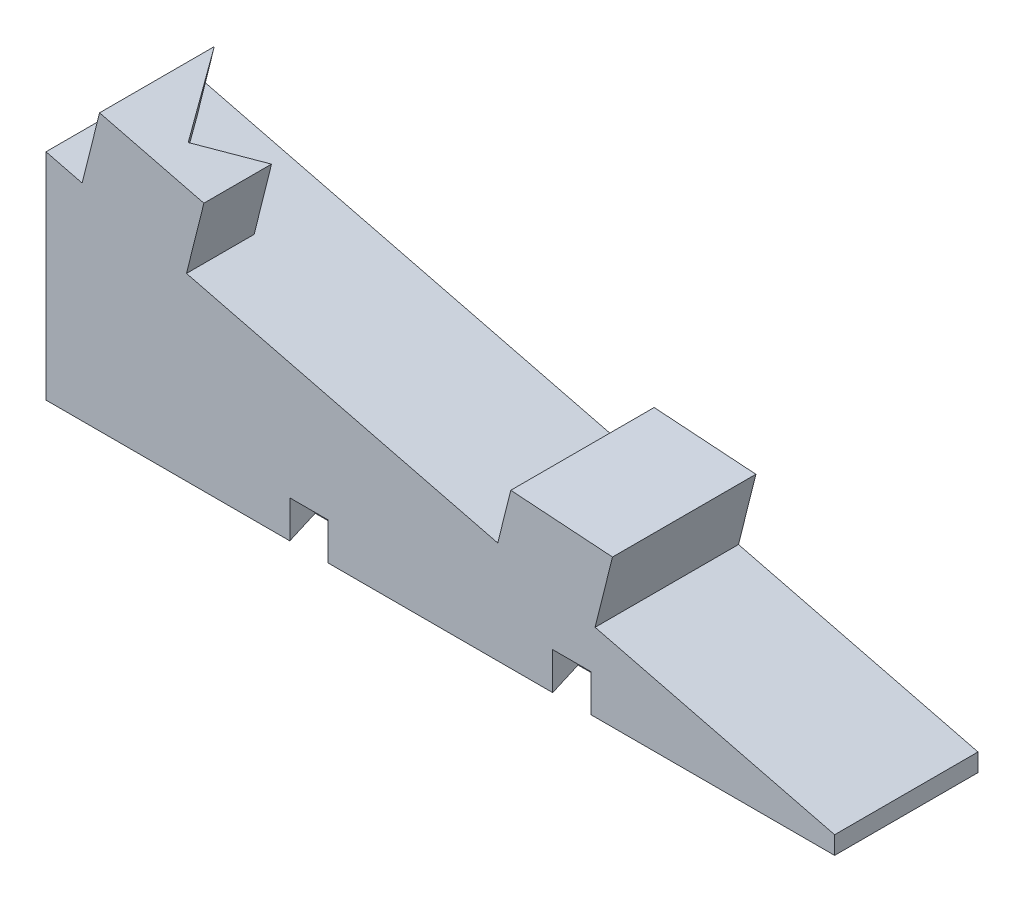
ISO-10303-21;
HEADER;
FILE_DESCRIPTION(('STEP AP214'),'2;1');
FILE_NAME('part.step','',(''),(''),'','','');
FILE_SCHEMA(('AUTOMOTIVE_DESIGN { 1 0 10303 214 1 1 1 1 }'));
ENDSEC;
DATA;
#1=APPLICATION_CONTEXT('core data for automotive mechanical design processes');
#2=APPLICATION_PROTOCOL_DEFINITION('international standard','automotive_design',2000,#1);
#3=PRODUCT_CONTEXT('',#1,'mechanical');
#4=PRODUCT('Part','Part','',(#3));
#5=PRODUCT_RELATED_PRODUCT_CATEGORY('part','',(#4));
#6=PRODUCT_DEFINITION_FORMATION('','',#4);
#7=PRODUCT_DEFINITION_CONTEXT('part definition',#1,'design');
#8=PRODUCT_DEFINITION('design','',#6,#7);
#9=PRODUCT_DEFINITION_SHAPE('','',#8);
#10=(LENGTH_UNIT() NAMED_UNIT(*) SI_UNIT(.MILLI.,.METRE.));
#11=(NAMED_UNIT(*) PLANE_ANGLE_UNIT() SI_UNIT($,.RADIAN.));
#12=(NAMED_UNIT(*) SI_UNIT($,.STERADIAN.) SOLID_ANGLE_UNIT());
#13=UNCERTAINTY_MEASURE_WITH_UNIT(LENGTH_MEASURE(1.E-05),#10,'distance_accuracy_value','');
#14=(GEOMETRIC_REPRESENTATION_CONTEXT(3) GLOBAL_UNCERTAINTY_ASSIGNED_CONTEXT((#13)) GLOBAL_UNIT_ASSIGNED_CONTEXT((#10,
#11,#12)) REPRESENTATION_CONTEXT('',''));
#15=CARTESIAN_POINT('',(0.,0.,0.));
#16=DIRECTION('',(0.,0.,1.));
#17=DIRECTION('',(1.,0.,0.));
#18=AXIS2_PLACEMENT_3D('',#15,#16,#17);
#19=CARTESIAN_POINT('',(-55.,21.875,-10.));
#20=DIRECTION('',(0.242535625036333,0.970142500145332,0.));
#21=DIRECTION('',(-0.970142500145332,0.242535625036333,0.));
#22=AXIS2_PLACEMENT_3D('',#19,#20,#21);
#23=PLANE('',#22);
#24=DIRECTION('',(-0.970142500145332,0.242535625036333,0.));
#25=VECTOR('',#24,1.);
#26=CARTESIAN_POINT('',(-55.,21.875,-10.));
#27=LINE('',#26,#25);
#28=CARTESIAN_POINT('',(55.,-5.62499999999998,-10.));
#29=VERTEX_POINT('',#28);
#30=CARTESIAN_POINT('',(21.5927503864739,2.72681240338153,-10.));
#31=VERTEX_POINT('',#30);
#32=EDGE_CURVE('E266',#29,#31,#27,.T.);
#33=ORIENTED_EDGE('',*,*,#32,.T.);
#34=DIRECTION('',(0.,0.,-1.));
#35=VECTOR('',#34,1.);
#36=CARTESIAN_POINT('',(21.5927503864739,2.72681240338153,-10.));
#37=LINE('',#36,#35);
#38=CARTESIAN_POINT('',(21.5927503864739,2.72681240338153,10.));
#39=VERTEX_POINT('',#38);
#40=EDGE_CURVE('E201',#39,#31,#37,.T.);
#41=ORIENTED_EDGE('',*,*,#40,.F.);
#42=DIRECTION('',(-0.970142500145332,0.242535625036333,0.));
#43=VECTOR('',#42,1.);
#44=CARTESIAN_POINT('',(-55.,21.875,10.));
#45=LINE('',#44,#43);
#46=CARTESIAN_POINT('',(55.,-5.62499999999998,10.));
#47=VERTEX_POINT('',#46);
#48=EDGE_CURVE('E250',#47,#39,#45,.T.);
#49=ORIENTED_EDGE('',*,*,#48,.F.);
#50=DIRECTION('',(0.,0.,1.));
#51=VECTOR('',#50,1.);
#52=CARTESIAN_POINT('',(55.,-5.62499999999998,-10.));
#53=LINE('',#52,#51);
#54=EDGE_CURVE('E274',#29,#47,#53,.T.);
#55=ORIENTED_EDGE('',*,*,#54,.F.);
#56=EDGE_LOOP('',(#33,#41,#49,#55));
#57=FACE_BOUND('',#56,.T.);
#58=ADVANCED_FACE('F33',(#57),#23,.T.);
#59=CARTESIAN_POINT('',(8.01075538443929,6.12231115389018,10.));
#60=VERTEX_POINT('',#59);
#61=CARTESIAN_POINT('',(-35.4031214970643,16.9757803742661,10.));
#62=VERTEX_POINT('',#61);
#63=EDGE_CURVE('E254',#60,#62,#45,.T.);
#64=ORIENTED_EDGE('',*,*,#63,.F.);
#65=DIRECTION('',(0.,0.,1.));
#66=VECTOR('',#65,1.);
#67=CARTESIAN_POINT('',(8.01075538443929,6.12231115389019,-10.));
#68=LINE('',#67,#66);
#69=CARTESIAN_POINT('',(8.01075538443929,6.12231115389019,-10.));
#70=VERTEX_POINT('',#69);
#71=EDGE_CURVE('E187',#70,#60,#68,.T.);
#72=ORIENTED_EDGE('',*,*,#71,.F.);
#73=CARTESIAN_POINT('',(-55.,21.875,-10.));
#74=VERTEX_POINT('',#73);
#75=EDGE_CURVE('E265',#70,#74,#27,.T.);
#76=ORIENTED_EDGE('',*,*,#75,.T.);
#77=DIRECTION('',(0.,0.,1.));
#78=VECTOR('',#77,1.);
#79=CARTESIAN_POINT('',(-55.,21.875,-10.));
#80=LINE('',#79,#78);
#81=CARTESIAN_POINT('',(-55.,21.875,10.));
#82=VERTEX_POINT('',#81);
#83=EDGE_CURVE('E281',#74,#82,#80,.T.);
#84=ORIENTED_EDGE('',*,*,#83,.T.);
#85=CARTESIAN_POINT('',(-49.9552589992443,20.6138147498111,10.));
#86=VERTEX_POINT('',#85);
#87=EDGE_CURVE('E249',#86,#82,#45,.T.);
#88=ORIENTED_EDGE('',*,*,#87,.F.);
#89=DIRECTION('',(0.,0.,1.));
#90=VECTOR('',#89,1.);
#91=CARTESIAN_POINT('',(-49.9552589992443,20.6138147498111,10.));
#92=LINE('',#91,#90);
#93=CARTESIAN_POINT('',(-49.9552589992443,20.6138147498111,-6.));
#94=VERTEX_POINT('',#93);
#95=EDGE_CURVE('E216',#94,#86,#92,.T.);
#96=ORIENTED_EDGE('',*,*,#95,.F.);
#97=DIRECTION('',(-0.558197093688558,0.139549273422139,-0.817888748476833));
#98=VECTOR('',#97,1.);
#99=CARTESIAN_POINT('',(-49.9552589992443,20.6138147498111,-6.));
#100=LINE('',#99,#98);
#101=CARTESIAN_POINT('',(-42.1404996876045,18.6601249219011,5.45044247867566));
#102=VERTEX_POINT('',#101);
#103=EDGE_CURVE('E227',#102,#94,#100,.T.);
#104=ORIENTED_EDGE('',*,*,#103,.F.);
#105=DIRECTION('',(-0.793468635288051,0.198367158822013,0.575376394297681));
#106=VECTOR('',#105,1.);
#107=CARTESIAN_POINT('',(-42.1404996876045,18.6601249219011,5.45044247867566));
#108=LINE('',#107,#106);
#109=CARTESIAN_POINT('',(-35.4031214970643,16.9757803742661,0.564895403603752));
#110=VERTEX_POINT('',#109);
#111=EDGE_CURVE('E206',#110,#102,#108,.T.);
#112=ORIENTED_EDGE('',*,*,#111,.F.);
#113=DIRECTION('',(0.,0.,-1.));
#114=VECTOR('',#113,1.);
#115=CARTESIAN_POINT('',(-35.4031214970643,16.9757803742661,0.564895403603752));
#116=LINE('',#115,#114);
#117=EDGE_CURVE('E203',#62,#110,#116,.T.);
#118=ORIENTED_EDGE('',*,*,#117,.F.);
#119=EDGE_LOOP('',(#64,#72,#76,#84,#88,#96,#104,#112,#118));
#120=FACE_BOUND('',#119,.T.);
#121=ADVANCED_FACE('F365',(#120),#23,.T.);
#122=CARTESIAN_POINT('',(55.,-5.62499999999998,-10.));
#123=DIRECTION('',(1.,0.,0.));
#124=DIRECTION('',(0.,0.,-1.));
#125=AXIS2_PLACEMENT_3D('',#122,#123,#124);
#126=PLANE('',#125);
#127=ORIENTED_EDGE('',*,*,#54,.T.);
#128=DIRECTION('',(0.,1.,0.));
#129=VECTOR('',#128,1.);
#130=CARTESIAN_POINT('',(55.,-5.62499999999998,10.));
#131=LINE('',#130,#129);
#132=CARTESIAN_POINT('',(55.,-8.12499999999996,10.));
#133=VERTEX_POINT('',#132);
#134=EDGE_CURVE('E246',#133,#47,#131,.T.);
#135=ORIENTED_EDGE('',*,*,#134,.F.);
#136=DIRECTION('',(0.,0.,1.));
#137=VECTOR('',#136,1.);
#138=CARTESIAN_POINT('',(55.,-8.12499999999996,-10.));
#139=LINE('',#138,#137);
#140=CARTESIAN_POINT('',(55.,-8.12499999999996,-10.));
#141=VERTEX_POINT('',#140);
#142=EDGE_CURVE('E275',#141,#133,#139,.T.);
#143=ORIENTED_EDGE('',*,*,#142,.F.);
#144=DIRECTION('',(0.,1.,0.));
#145=VECTOR('',#144,1.);
#146=CARTESIAN_POINT('',(55.,-5.62499999999998,-10.));
#147=LINE('',#146,#145);
#148=EDGE_CURVE('E261',#141,#29,#147,.T.);
#149=ORIENTED_EDGE('',*,*,#148,.T.);
#150=EDGE_LOOP('',(#127,#135,#143,#149));
#151=FACE_BOUND('',#150,.T.);
#152=ADVANCED_FACE('F35',(#151),#126,.T.);
#153=CARTESIAN_POINT('',(-55.,-8.125,-10.));
#154=DIRECTION('',(0.,-1.,0.));
#155=DIRECTION('',(1.,0.,0.));
#156=AXIS2_PLACEMENT_3D('',#153,#154,#155);
#157=PLANE('',#156);
#158=DIRECTION('',(-0.292714272094112,0.,0.956199955507432));
#159=VECTOR('',#158,1.);
#160=CARTESIAN_POINT('',(-14.112947570471,-8.12499999999995,4.90000000000001));
#161=LINE('',#160,#159);
#162=CARTESIAN_POINT('',(-14.112947570471,-8.12499999999995,4.90000000000001));
#163=VERTEX_POINT('',#162);
#164=CARTESIAN_POINT('',(-15.6741720602669,-8.12499999999991,10.));
#165=VERTEX_POINT('',#164);
#166=EDGE_CURVE('E588',#163,#165,#161,.T.);
#167=ORIENTED_EDGE('',*,*,#166,.F.);
#168=DIRECTION('',(1.,0.,0.));
#169=VECTOR('',#168,1.);
#170=CARTESIAN_POINT('',(-22.5537190961957,-8.12499999999995,4.90000000000001));
#171=LINE('',#170,#169);
#172=CARTESIAN_POINT('',(-22.5537190961957,-8.12499999999995,4.90000000000001));
#173=VERTEX_POINT('',#172);
#174=EDGE_CURVE('E310',#173,#163,#171,.T.);
#175=ORIENTED_EDGE('',*,*,#174,.F.);
#176=DIRECTION('',(-0.292714272094112,0.,-0.956199955507432));
#177=VECTOR('',#176,1.);
#178=CARTESIAN_POINT('',(-20.9745733244348,-8.12499999999991,10.0585428544188));
#179=LINE('',#178,#177);
#180=CARTESIAN_POINT('',(-20.9924946063997,-8.12499999999991,10.));
#181=VERTEX_POINT('',#180);
#182=EDGE_CURVE('E300',#181,#173,#179,.T.);
#183=ORIENTED_EDGE('',*,*,#182,.F.);
#184=DIRECTION('',(1.,0.,0.));
#185=VECTOR('',#184,1.);
#186=CARTESIAN_POINT('',(-55.,-8.125,10.));
#187=LINE('',#186,#185);
#188=CARTESIAN_POINT('',(-55.,-8.125,10.));
#189=VERTEX_POINT('',#188);
#190=EDGE_CURVE('E258',#189,#181,#187,.T.);
#191=ORIENTED_EDGE('',*,*,#190,.F.);
#192=DIRECTION('',(0.,0.,1.));
#193=VECTOR('',#192,1.);
#194=CARTESIAN_POINT('',(-55.,-8.125,-10.));
#195=LINE('',#194,#193);
#196=CARTESIAN_POINT('',(-55.,-8.125,-10.));
#197=VERTEX_POINT('',#196);
#198=EDGE_CURVE('E279',#197,#189,#195,.T.);
#199=ORIENTED_EDGE('',*,*,#198,.F.);
#200=DIRECTION('',(1.,0.,0.));
#201=VECTOR('',#200,1.);
#202=CARTESIAN_POINT('',(-55.,-8.125,-10.));
#203=LINE('',#202,#201);
#204=EDGE_CURVE('E271',#197,#141,#203,.T.);
#205=ORIENTED_EDGE('',*,*,#204,.T.);
#206=ORIENTED_EDGE('',*,*,#142,.T.);
#207=CARTESIAN_POINT('',(20.9924946063998,-8.1249999999999,10.));
#208=VERTEX_POINT('',#207);
#209=EDGE_CURVE('E257',#208,#133,#187,.T.);
#210=ORIENTED_EDGE('',*,*,#209,.F.);
#211=DIRECTION('',(-0.292714272094112,0.,0.956199955507432));
#212=VECTOR('',#211,1.);
#213=CARTESIAN_POINT('',(22.5537190961957,-8.12499999999994,4.90000000000001));
#214=LINE('',#213,#212);
#215=CARTESIAN_POINT('',(22.5537190961957,-8.12499999999994,4.90000000000001));
#216=VERTEX_POINT('',#215);
#217=EDGE_CURVE('E342',#216,#208,#214,.T.);
#218=ORIENTED_EDGE('',*,*,#217,.F.);
#219=DIRECTION('',(1.,0.,0.));
#220=VECTOR('',#219,1.);
#221=CARTESIAN_POINT('',(14.112947570471,-8.12499999999994,4.90000000000001));
#222=LINE('',#221,#220);
#223=CARTESIAN_POINT('',(14.112947570471,-8.12499999999994,4.90000000000001));
#224=VERTEX_POINT('',#223);
#225=EDGE_CURVE('E339',#224,#216,#222,.T.);
#226=ORIENTED_EDGE('',*,*,#225,.F.);
#227=DIRECTION('',(-0.292714272094112,0.,-0.956199955507432));
#228=VECTOR('',#227,1.);
#229=CARTESIAN_POINT('',(15.6920933422319,-8.1249999999999,10.0585428544188));
#230=LINE('',#229,#228);
#231=CARTESIAN_POINT('',(15.6741720602669,-8.1249999999999,10.));
#232=VERTEX_POINT('',#231);
#233=EDGE_CURVE('E334',#232,#224,#230,.T.);
#234=ORIENTED_EDGE('',*,*,#233,.F.);
#235=EDGE_CURVE('E262',#165,#232,#187,.T.);
#236=ORIENTED_EDGE('',*,*,#235,.F.);
#237=EDGE_LOOP('',(#167,#175,#183,#191,#199,#205,#206,#210,#218,#226,#234,#236));
#238=FACE_BOUND('',#237,.T.);
#239=ADVANCED_FACE('F308',(#238),#157,.T.);
#240=CARTESIAN_POINT('',(-55.,21.875,-10.));
#241=DIRECTION('',(-1.,0.,0.));
#242=DIRECTION('',(0.,-1.,0.));
#243=AXIS2_PLACEMENT_3D('',#240,#241,#242);
#244=PLANE('',#243);
#245=ORIENTED_EDGE('',*,*,#198,.T.);
#246=DIRECTION('',(0.,-1.,0.));
#247=VECTOR('',#246,1.);
#248=CARTESIAN_POINT('',(-55.,21.875,10.));
#249=LINE('',#248,#247);
#250=EDGE_CURVE('E253',#82,#189,#249,.T.);
#251=ORIENTED_EDGE('',*,*,#250,.F.);
#252=ORIENTED_EDGE('',*,*,#83,.F.);
#253=DIRECTION('',(0.,-1.,0.));
#254=VECTOR('',#253,1.);
#255=CARTESIAN_POINT('',(-55.,21.875,-10.));
#256=LINE('',#255,#254);
#257=EDGE_CURVE('E268',#74,#197,#256,.T.);
#258=ORIENTED_EDGE('',*,*,#257,.T.);
#259=EDGE_LOOP('',(#245,#251,#252,#258));
#260=FACE_BOUND('',#259,.T.);
#261=ADVANCED_FACE('F316',(#260),#244,.T.);
#262=CARTESIAN_POINT('',(0.,0.,-10.));
#263=DIRECTION('',(0.,0.,1.));
#264=DIRECTION('',(1.,0.,0.));
#265=AXIS2_PLACEMENT_3D('',#262,#263,#264);
#266=PLANE('',#265);
#267=DIRECTION('',(-0.242535625036333,-0.970142500145332,0.));
#268=VECTOR('',#267,1.);
#269=CARTESIAN_POINT('',(10.4361116348026,15.8237361553435,-10.));
#270=LINE('',#269,#268);
#271=CARTESIAN_POINT('',(9.82977257221179,13.3983799049802,-10.));
#272=VERTEX_POINT('',#271);
#273=EDGE_CURVE('E196',#272,#70,#270,.T.);
#274=ORIENTED_EDGE('',*,*,#273,.F.);
#275=DIRECTION('',(0.997670521695976,-0.0682167878082718,0.));
#276=VECTOR('',#275,1.);
#277=CARTESIAN_POINT('',(24.0181066368373,12.4282374048348,-10.));
#278=LINE('',#277,#276);
#279=CARTESIAN_POINT('',(24.0181066368373,12.4282374048348,-10.));
#280=VERTEX_POINT('',#279);
#281=EDGE_CURVE('E179',#272,#280,#278,.T.);
#282=ORIENTED_EDGE('',*,*,#281,.T.);
#283=DIRECTION('',(-0.242535625036333,-0.970142500145332,0.));
#284=VECTOR('',#283,1.);
#285=CARTESIAN_POINT('',(24.0181066368373,12.4282374048348,-10.));
#286=LINE('',#285,#284);
#287=EDGE_CURVE('E193',#280,#31,#286,.T.);
#288=ORIENTED_EDGE('',*,*,#287,.T.);
#289=ORIENTED_EDGE('',*,*,#32,.F.);
#290=ORIENTED_EDGE('',*,*,#148,.F.);
#291=ORIENTED_EDGE('',*,*,#204,.F.);
#292=ORIENTED_EDGE('',*,*,#257,.F.);
#293=ORIENTED_EDGE('',*,*,#75,.F.);
#294=EDGE_LOOP('',(#274,#282,#288,#289,#290,#291,#292,#293));
#295=FACE_BOUND('',#294,.T.);
#296=ADVANCED_FACE('F191',(#295),#266,.F.);
#297=CARTESIAN_POINT('',(0.,0.,10.));
#298=DIRECTION('',(0.,0.,1.));
#299=DIRECTION('',(1.,0.,0.));
#300=AXIS2_PLACEMENT_3D('',#297,#298,#299);
#301=PLANE('',#300);
#302=DIRECTION('',(0.997670521695976,-0.0682167878082718,0.));
#303=VECTOR('',#302,1.);
#304=CARTESIAN_POINT('',(24.0181066368373,12.4282374048348,10.));
#305=LINE('',#304,#303);
#306=CARTESIAN_POINT('',(9.82977257221179,13.3983799049802,10.));
#307=VERTEX_POINT('',#306);
#308=CARTESIAN_POINT('',(24.0181066368373,12.4282374048348,10.));
#309=VERTEX_POINT('',#308);
#310=EDGE_CURVE('E182',#307,#309,#305,.T.);
#311=ORIENTED_EDGE('',*,*,#310,.F.);
#312=DIRECTION('',(-0.242535625036333,-0.970142500145332,0.));
#313=VECTOR('',#312,1.);
#314=CARTESIAN_POINT('',(10.4361116348026,15.8237361553435,10.));
#315=LINE('',#314,#313);
#316=EDGE_CURVE('E208',#307,#60,#315,.T.);
#317=ORIENTED_EDGE('',*,*,#316,.T.);
#318=ORIENTED_EDGE('',*,*,#63,.T.);
#319=DIRECTION('',(-0.242535625036333,-0.970142500145332,0.));
#320=VECTOR('',#319,1.);
#321=CARTESIAN_POINT('',(-32.977765246701,26.6772053757194,10.));
#322=LINE('',#321,#320);
#323=CARTESIAN_POINT('',(-32.977765246701,26.6772053757194,10.));
#324=VERTEX_POINT('',#323);
#325=EDGE_CURVE('E223',#324,#62,#322,.T.);
#326=ORIENTED_EDGE('',*,*,#325,.F.);
#327=DIRECTION('',(0.970142500145332,-0.242535625036333,0.));
#328=VECTOR('',#327,1.);
#329=CARTESIAN_POINT('',(-47.529902748881,30.3152397512644,10.));
#330=LINE('',#329,#328);
#331=CARTESIAN_POINT('',(-47.529902748881,30.3152397512644,10.));
#332=VERTEX_POINT('',#331);
#333=EDGE_CURVE('E222',#332,#324,#330,.T.);
#334=ORIENTED_EDGE('',*,*,#333,.F.);
#335=DIRECTION('',(-0.242535625036333,-0.970142500145332,0.));
#336=VECTOR('',#335,1.);
#337=CARTESIAN_POINT('',(-47.529902748881,30.3152397512644,10.));
#338=LINE('',#337,#336);
#339=EDGE_CURVE('E234',#332,#86,#338,.T.);
#340=ORIENTED_EDGE('',*,*,#339,.T.);
#341=ORIENTED_EDGE('',*,*,#87,.T.);
#342=ORIENTED_EDGE('',*,*,#250,.T.);
#343=ORIENTED_EDGE('',*,*,#190,.T.);
#344=DIRECTION('',(0.,-1.,0.));
#345=VECTOR('',#344,1.);
#346=CARTESIAN_POINT('',(-20.9924946063997,0.,10.));
#347=LINE('',#346,#345);
#348=CARTESIAN_POINT('',(-20.9924946063997,-2.92499999999992,10.));
#349=VERTEX_POINT('',#348);
#350=EDGE_CURVE('E41',#349,#181,#347,.T.);
#351=ORIENTED_EDGE('',*,*,#350,.F.);
#352=DIRECTION('',(1.,0.,0.));
#353=VECTOR('',#352,1.);
#354=CARTESIAN_POINT('',(0.,-2.92499999999991,10.));
#355=LINE('',#354,#353);
#356=CARTESIAN_POINT('',(-15.6741720602669,-2.92499999999991,10.));
#357=VERTEX_POINT('',#356);
#358=EDGE_CURVE('E292',#349,#357,#355,.T.);
#359=ORIENTED_EDGE('',*,*,#358,.T.);
#360=DIRECTION('',(0.,1.,0.));
#361=VECTOR('',#360,1.);
#362=CARTESIAN_POINT('',(-15.6741720602669,0.,10.));
#363=LINE('',#362,#361);
#364=EDGE_CURVE('E11',#165,#357,#363,.T.);
#365=ORIENTED_EDGE('',*,*,#364,.F.);
#366=ORIENTED_EDGE('',*,*,#235,.T.);
#367=DIRECTION('',(0.,-1.,0.));
#368=VECTOR('',#367,1.);
#369=CARTESIAN_POINT('',(15.6741720602669,0.,10.));
#370=LINE('',#369,#368);
#371=CARTESIAN_POINT('',(15.6741720602669,-2.92499999999991,10.));
#372=VERTEX_POINT('',#371);
#373=EDGE_CURVE('E287',#372,#232,#370,.T.);
#374=ORIENTED_EDGE('',*,*,#373,.F.);
#375=DIRECTION('',(1.,0.,0.));
#376=VECTOR('',#375,1.);
#377=CARTESIAN_POINT('',(0.,-2.92499999999991,10.));
#378=LINE('',#377,#376);
#379=CARTESIAN_POINT('',(20.9924946063998,-2.9249999999999,10.));
#380=VERTEX_POINT('',#379);
#381=EDGE_CURVE('E278',#372,#380,#378,.T.);
#382=ORIENTED_EDGE('',*,*,#381,.T.);
#383=DIRECTION('',(0.,1.,0.));
#384=VECTOR('',#383,1.);
#385=CARTESIAN_POINT('',(20.9924946063998,0.,10.));
#386=LINE('',#385,#384);
#387=EDGE_CURVE('E290',#208,#380,#386,.T.);
#388=ORIENTED_EDGE('',*,*,#387,.F.);
#389=ORIENTED_EDGE('',*,*,#209,.T.);
#390=ORIENTED_EDGE('',*,*,#134,.T.);
#391=ORIENTED_EDGE('',*,*,#48,.T.);
#392=DIRECTION('',(-0.242535625036333,-0.970142500145332,0.));
#393=VECTOR('',#392,1.);
#394=CARTESIAN_POINT('',(24.0181066368373,12.4282374048348,10.));
#395=LINE('',#394,#393);
#396=EDGE_CURVE('E186',#309,#39,#395,.T.);
#397=ORIENTED_EDGE('',*,*,#396,.F.);
#398=EDGE_LOOP('',(#311,#317,#318,#326,#334,#340,#341,#342,#343,#351,#359,#365,#366,#374,#382,
#388,#389,#390,#391,#397));
#399=FACE_BOUND('',#398,.T.);
#400=ADVANCED_FACE('F312',(#399),#301,.T.);
#401=CARTESIAN_POINT('',(-32.977765246701,26.6772053757194,0.564895403603752));
#402=DIRECTION('',(-0.970142500145332,0.242535625036333,0.));
#403=DIRECTION('',(-0.242535625036333,-0.970142500145332,0.));
#404=AXIS2_PLACEMENT_3D('',#401,#402,#403);
#405=PLANE('',#404);
#406=ORIENTED_EDGE('',*,*,#117,.T.);
#407=DIRECTION('',(-0.242535625036333,-0.970142500145332,0.));
#408=VECTOR('',#407,1.);
#409=CARTESIAN_POINT('',(-32.977765246701,26.6772053757194,0.564895403603752));
#410=LINE('',#409,#408);
#411=CARTESIAN_POINT('',(-32.977765246701,26.6772053757194,0.564895403603752));
#412=VERTEX_POINT('',#411);
#413=EDGE_CURVE('E243',#412,#110,#410,.T.);
#414=ORIENTED_EDGE('',*,*,#413,.F.);
#415=DIRECTION('',(0.,0.,-1.));
#416=VECTOR('',#415,1.);
#417=CARTESIAN_POINT('',(-32.977765246701,26.6772053757194,0.564895403603752));
#418=LINE('',#417,#416);
#419=EDGE_CURVE('E212',#324,#412,#418,.T.);
#420=ORIENTED_EDGE('',*,*,#419,.F.);
#421=ORIENTED_EDGE('',*,*,#325,.T.);
#422=EDGE_LOOP('',(#406,#414,#420,#421));
#423=FACE_BOUND('',#422,.T.);
#424=ADVANCED_FACE('F369',(#423),#405,.F.);
#425=CARTESIAN_POINT('',(-39.7151434372411,28.3615499233544,5.45044247867566));
#426=DIRECTION('',(0.558197093688559,-0.13954927342214,0.817888748476833));
#427=DIRECTION('',(0.825970766465843,0.,-0.563712952613144));
#428=AXIS2_PLACEMENT_3D('',#425,#426,#427);
#429=PLANE('',#428);
#430=ORIENTED_EDGE('',*,*,#111,.T.);
#431=DIRECTION('',(-0.242535625036333,-0.970142500145332,0.));
#432=VECTOR('',#431,1.);
#433=CARTESIAN_POINT('',(-39.7151434372411,28.3615499233544,5.45044247867566));
#434=LINE('',#433,#432);
#435=CARTESIAN_POINT('',(-39.7151434372411,28.3615499233544,5.45044247867566));
#436=VERTEX_POINT('',#435);
#437=EDGE_CURVE('E240',#436,#102,#434,.T.);
#438=ORIENTED_EDGE('',*,*,#437,.F.);
#439=DIRECTION('',(-0.793468635288051,0.198367158822013,0.575376394297681));
#440=VECTOR('',#439,1.);
#441=CARTESIAN_POINT('',(-39.7151434372411,28.3615499233544,5.45044247867566));
#442=LINE('',#441,#440);
#443=EDGE_CURVE('E215',#412,#436,#442,.T.);
#444=ORIENTED_EDGE('',*,*,#443,.F.);
#445=ORIENTED_EDGE('',*,*,#413,.T.);
#446=EDGE_LOOP('',(#430,#438,#444,#445));
#447=FACE_BOUND('',#446,.T.);
#448=ADVANCED_FACE('F383',(#447),#429,.F.);
#449=CARTESIAN_POINT('',(-47.529902748881,30.3152397512644,-6.));
#450=DIRECTION('',(-0.793468635288051,0.198367158822013,0.575376394297681));
#451=DIRECTION('',(0.587042224992811,0.,0.809556314332419));
#452=AXIS2_PLACEMENT_3D('',#449,#450,#451);
#453=PLANE('',#452);
#454=ORIENTED_EDGE('',*,*,#103,.T.);
#455=DIRECTION('',(-0.242535625036333,-0.970142500145332,0.));
#456=VECTOR('',#455,1.);
#457=CARTESIAN_POINT('',(-47.529902748881,30.3152397512644,-6.));
#458=LINE('',#457,#456);
#459=CARTESIAN_POINT('',(-47.529902748881,30.3152397512644,-6.));
#460=VERTEX_POINT('',#459);
#461=EDGE_CURVE('E237',#460,#94,#458,.T.);
#462=ORIENTED_EDGE('',*,*,#461,.F.);
#463=DIRECTION('',(-0.558197093688558,0.139549273422139,-0.817888748476833));
#464=VECTOR('',#463,1.);
#465=CARTESIAN_POINT('',(-47.529902748881,30.3152397512644,-6.));
#466=LINE('',#465,#464);
#467=EDGE_CURVE('E218',#436,#460,#466,.T.);
#468=ORIENTED_EDGE('',*,*,#467,.F.);
#469=ORIENTED_EDGE('',*,*,#437,.T.);
#470=EDGE_LOOP('',(#454,#462,#468,#469));
#471=FACE_BOUND('',#470,.T.);
#472=ADVANCED_FACE('F380',(#471),#453,.F.);
#473=CARTESIAN_POINT('',(-47.529902748881,30.3152397512644,10.));
#474=DIRECTION('',(0.970142500145332,-0.242535625036333,0.));
#475=DIRECTION('',(0.242535625036333,0.970142500145332,0.));
#476=AXIS2_PLACEMENT_3D('',#473,#474,#475);
#477=PLANE('',#476);
#478=ORIENTED_EDGE('',*,*,#95,.T.);
#479=ORIENTED_EDGE('',*,*,#339,.F.);
#480=DIRECTION('',(0.,0.,1.));
#481=VECTOR('',#480,1.);
#482=CARTESIAN_POINT('',(-47.529902748881,30.3152397512644,10.));
#483=LINE('',#482,#481);
#484=EDGE_CURVE('E220',#460,#332,#483,.T.);
#485=ORIENTED_EDGE('',*,*,#484,.F.);
#486=ORIENTED_EDGE('',*,*,#461,.T.);
#487=EDGE_LOOP('',(#478,#479,#485,#486));
#488=FACE_BOUND('',#487,.T.);
#489=ADVANCED_FACE('F378',(#488),#477,.F.);
#490=CARTESIAN_POINT('',(4.33712095624568,17.3484838249827,0.));
#491=DIRECTION('',(0.242535625036333,0.970142500145332,0.));
#492=DIRECTION('',(-0.970142500145332,0.242535625036333,0.));
#493=AXIS2_PLACEMENT_3D('',#490,#491,#492);
#494=PLANE('',#493);
#495=ORIENTED_EDGE('',*,*,#419,.T.);
#496=ORIENTED_EDGE('',*,*,#443,.T.);
#497=ORIENTED_EDGE('',*,*,#467,.T.);
#498=ORIENTED_EDGE('',*,*,#484,.T.);
#499=ORIENTED_EDGE('',*,*,#333,.T.);
#500=EDGE_LOOP('',(#495,#496,#497,#498,#499));
#501=FACE_BOUND('',#500,.T.);
#502=ADVANCED_FACE('F373',(#501),#494,.T.);
#503=CARTESIAN_POINT('',(24.0181066368373,12.4282374048348,-10.));
#504=DIRECTION('',(-0.970142500145332,0.242535625036333,0.));
#505=DIRECTION('',(-0.242535625036333,-0.970142500145332,0.));
#506=AXIS2_PLACEMENT_3D('',#503,#504,#505);
#507=PLANE('',#506);
#508=ORIENTED_EDGE('',*,*,#40,.T.);
#509=ORIENTED_EDGE('',*,*,#287,.F.);
#510=DIRECTION('',(0.,0.,-1.));
#511=VECTOR('',#510,1.);
#512=CARTESIAN_POINT('',(24.0181066368373,12.4282374048348,-10.));
#513=LINE('',#512,#511);
#514=EDGE_CURVE('E176',#309,#280,#513,.T.);
#515=ORIENTED_EDGE('',*,*,#514,.F.);
#516=ORIENTED_EDGE('',*,*,#396,.T.);
#517=EDGE_LOOP('',(#508,#509,#515,#516));
#518=FACE_BOUND('',#517,.T.);
#519=ADVANCED_FACE('F199',(#518),#507,.F.);
#520=CARTESIAN_POINT('',(10.4361116348026,15.8237361553435,-10.));
#521=DIRECTION('',(0.970142500145332,-0.242535625036333,0.));
#522=DIRECTION('',(0.242535625036333,0.970142500145332,0.));
#523=AXIS2_PLACEMENT_3D('',#520,#521,#522);
#524=PLANE('',#523);
#525=ORIENTED_EDGE('',*,*,#316,.F.);
#526=DIRECTION('',(0.,0.,1.));
#527=VECTOR('',#526,1.);
#528=CARTESIAN_POINT('',(9.82977257221179,13.3983799049802,-10.));
#529=LINE('',#528,#527);
#530=EDGE_CURVE('E197',#272,#307,#529,.T.);
#531=ORIENTED_EDGE('',*,*,#530,.F.);
#532=ORIENTED_EDGE('',*,*,#273,.T.);
#533=ORIENTED_EDGE('',*,*,#71,.T.);
#534=EDGE_LOOP('',(#525,#531,#532,#533));
#535=FACE_BOUND('',#534,.T.);
#536=ADVANCED_FACE('F363',(#535),#524,.F.);
#537=CARTESIAN_POINT('',(22.5537190961957,-2.92499999999994,4.90000000000001));
#538=DIRECTION('',(0.956199955507432,0.,0.292714272094112));
#539=DIRECTION('',(0.292714272094112,0.,-0.956199955507432));
#540=AXIS2_PLACEMENT_3D('',#537,#538,#539);
#541=PLANE('',#540);
#542=ORIENTED_EDGE('',*,*,#387,.T.);
#543=DIRECTION('',(-0.292714272094112,0.,0.956199955507432));
#544=VECTOR('',#543,1.);
#545=CARTESIAN_POINT('',(22.5537190961957,-2.92499999999994,4.90000000000001));
#546=LINE('',#545,#544);
#547=CARTESIAN_POINT('',(22.5537190961957,-2.92499999999994,4.90000000000001));
#548=VERTEX_POINT('',#547);
#549=EDGE_CURVE('E55',#548,#380,#546,.T.);
#550=ORIENTED_EDGE('',*,*,#549,.F.);
#551=DIRECTION('',(0.,-1.,0.));
#552=VECTOR('',#551,1.);
#553=CARTESIAN_POINT('',(22.5537190961957,-2.92499999999994,4.90000000000001));
#554=LINE('',#553,#552);
#555=EDGE_CURVE('E350',#548,#216,#554,.T.);
#556=ORIENTED_EDGE('',*,*,#555,.T.);
#557=ORIENTED_EDGE('',*,*,#217,.T.);
#558=EDGE_LOOP('',(#542,#550,#556,#557));
#559=FACE_BOUND('',#558,.T.);
#560=ADVANCED_FACE('F460',(#559),#541,.F.);
#561=CARTESIAN_POINT('',(14.112947570471,-2.92499999999994,4.90000000000001));
#562=DIRECTION('',(0.,0.,-1.));
#563=DIRECTION('',(-1.,0.,0.));
#564=AXIS2_PLACEMENT_3D('',#561,#562,#563);
#565=PLANE('',#564);
#566=ORIENTED_EDGE('',*,*,#225,.T.);
#567=ORIENTED_EDGE('',*,*,#555,.F.);
#568=DIRECTION('',(1.,0.,0.));
#569=VECTOR('',#568,1.);
#570=CARTESIAN_POINT('',(14.112947570471,-2.92499999999994,4.90000000000001));
#571=LINE('',#570,#569);
#572=CARTESIAN_POINT('',(14.112947570471,-2.92499999999994,4.90000000000001));
#573=VERTEX_POINT('',#572);
#574=EDGE_CURVE('E597',#573,#548,#571,.T.);
#575=ORIENTED_EDGE('',*,*,#574,.F.);
#576=DIRECTION('',(0.,-1.,0.));
#577=VECTOR('',#576,1.);
#578=CARTESIAN_POINT('',(14.112947570471,-2.92499999999994,4.90000000000001));
#579=LINE('',#578,#577);
#580=EDGE_CURVE('E352',#573,#224,#579,.T.);
#581=ORIENTED_EDGE('',*,*,#580,.T.);
#582=EDGE_LOOP('',(#566,#567,#575,#581));
#583=FACE_BOUND('',#582,.T.);
#584=ADVANCED_FACE('F465',(#583),#565,.F.);
#585=CARTESIAN_POINT('',(15.6920933422319,-2.92499999999991,10.0585428544188));
#586=DIRECTION('',(-0.956199955507432,0.,0.292714272094112));
#587=DIRECTION('',(0.292714272094112,0.,0.956199955507432));
#588=AXIS2_PLACEMENT_3D('',#585,#586,#587);
#589=PLANE('',#588);
#590=ORIENTED_EDGE('',*,*,#373,.T.);
#591=ORIENTED_EDGE('',*,*,#233,.T.);
#592=ORIENTED_EDGE('',*,*,#580,.F.);
#593=DIRECTION('',(-0.292714272094112,0.,-0.956199955507432));
#594=VECTOR('',#593,1.);
#595=CARTESIAN_POINT('',(15.6920933422319,-2.92499999999991,10.0585428544188));
#596=LINE('',#595,#594);
#597=EDGE_CURVE('E336',#372,#573,#596,.T.);
#598=ORIENTED_EDGE('',*,*,#597,.F.);
#599=EDGE_LOOP('',(#590,#591,#592,#598));
#600=FACE_BOUND('',#599,.T.);
#601=ADVANCED_FACE('F332',(#600),#589,.F.);
#602=CARTESIAN_POINT('',(0.,-2.92499999999998,0.));
#603=DIRECTION('',(0.,-1.,0.));
#604=DIRECTION('',(0.,0.,-1.));
#605=AXIS2_PLACEMENT_3D('',#602,#603,#604);
#606=PLANE('',#605);
#607=ORIENTED_EDGE('',*,*,#597,.T.);
#608=ORIENTED_EDGE('',*,*,#574,.T.);
#609=ORIENTED_EDGE('',*,*,#549,.T.);
#610=ORIENTED_EDGE('',*,*,#381,.F.);
#611=EDGE_LOOP('',(#607,#608,#609,#610));
#612=FACE_BOUND('',#611,.T.);
#613=ADVANCED_FACE('F486',(#612),#606,.T.);
#614=CARTESIAN_POINT('',(-14.112947570471,-2.92499999999995,4.90000000000001));
#615=DIRECTION('',(0.956199955507432,0.,0.292714272094112));
#616=DIRECTION('',(0.292714272094112,0.,-0.956199955507432));
#617=AXIS2_PLACEMENT_3D('',#614,#615,#616);
#618=PLANE('',#617);
#619=ORIENTED_EDGE('',*,*,#364,.T.);
#620=DIRECTION('',(-0.292714272094112,0.,0.956199955507432));
#621=VECTOR('',#620,1.);
#622=CARTESIAN_POINT('',(-14.112947570471,-2.92499999999995,4.90000000000001));
#623=LINE('',#622,#621);
#624=CARTESIAN_POINT('',(-14.112947570471,-2.92499999999995,4.90000000000001));
#625=VERTEX_POINT('',#624);
#626=EDGE_CURVE('E48',#625,#357,#623,.T.);
#627=ORIENTED_EDGE('',*,*,#626,.F.);
#628=DIRECTION('',(0.,-1.,0.));
#629=VECTOR('',#628,1.);
#630=CARTESIAN_POINT('',(-14.112947570471,-2.92499999999995,4.90000000000001));
#631=LINE('',#630,#629);
#632=EDGE_CURVE('E340',#625,#163,#631,.T.);
#633=ORIENTED_EDGE('',*,*,#632,.T.);
#634=ORIENTED_EDGE('',*,*,#166,.T.);
#635=EDGE_LOOP('',(#619,#627,#633,#634));
#636=FACE_BOUND('',#635,.T.);
#637=ADVANCED_FACE('F495',(#636),#618,.F.);
#638=CARTESIAN_POINT('',(-22.5537190961957,-2.92499999999995,4.90000000000001));
#639=DIRECTION('',(0.,0.,-1.));
#640=DIRECTION('',(-1.,0.,0.));
#641=AXIS2_PLACEMENT_3D('',#638,#639,#640);
#642=PLANE('',#641);
#643=ORIENTED_EDGE('',*,*,#174,.T.);
#644=ORIENTED_EDGE('',*,*,#632,.F.);
#645=DIRECTION('',(1.,0.,0.));
#646=VECTOR('',#645,1.);
#647=CARTESIAN_POINT('',(-22.5537190961957,-2.92499999999995,4.90000000000001));
#648=LINE('',#647,#646);
#649=CARTESIAN_POINT('',(-22.5537190961957,-2.92499999999995,4.90000000000001));
#650=VERTEX_POINT('',#649);
#651=EDGE_CURVE('E587',#650,#625,#648,.T.);
#652=ORIENTED_EDGE('',*,*,#651,.F.);
#653=DIRECTION('',(0.,-1.,0.));
#654=VECTOR('',#653,1.);
#655=CARTESIAN_POINT('',(-22.5537190961957,-2.92499999999995,4.90000000000001));
#656=LINE('',#655,#654);
#657=EDGE_CURVE('E344',#650,#173,#656,.T.);
#658=ORIENTED_EDGE('',*,*,#657,.T.);
#659=EDGE_LOOP('',(#643,#644,#652,#658));
#660=FACE_BOUND('',#659,.T.);
#661=ADVANCED_FACE('F504',(#660),#642,.F.);
#662=CARTESIAN_POINT('',(-20.9745733244348,-2.92499999999992,10.0585428544188));
#663=DIRECTION('',(-0.956199955507432,0.,0.292714272094112));
#664=DIRECTION('',(0.292714272094112,0.,0.956199955507432));
#665=AXIS2_PLACEMENT_3D('',#662,#663,#664);
#666=PLANE('',#665);
#667=ORIENTED_EDGE('',*,*,#350,.T.);
#668=ORIENTED_EDGE('',*,*,#182,.T.);
#669=ORIENTED_EDGE('',*,*,#657,.F.);
#670=DIRECTION('',(-0.292714272094112,0.,-0.956199955507432));
#671=VECTOR('',#670,1.);
#672=CARTESIAN_POINT('',(-20.9745733244348,-2.92499999999992,10.0585428544188));
#673=LINE('',#672,#671);
#674=EDGE_CURVE('E302',#349,#650,#673,.T.);
#675=ORIENTED_EDGE('',*,*,#674,.F.);
#676=EDGE_LOOP('',(#667,#668,#669,#675));
#677=FACE_BOUND('',#676,.T.);
#678=ADVANCED_FACE('F298',(#677),#666,.F.);
#679=CARTESIAN_POINT('',(0.,-2.92499999999998,0.));
#680=DIRECTION('',(0.,-1.,0.));
#681=DIRECTION('',(0.,0.,-1.));
#682=AXIS2_PLACEMENT_3D('',#679,#680,#681);
#683=PLANE('',#682);
#684=ORIENTED_EDGE('',*,*,#674,.T.);
#685=ORIENTED_EDGE('',*,*,#651,.T.);
#686=ORIENTED_EDGE('',*,*,#626,.T.);
#687=ORIENTED_EDGE('',*,*,#358,.F.);
#688=EDGE_LOOP('',(#684,#685,#686,#687));
#689=FACE_BOUND('',#688,.T.);
#690=ADVANCED_FACE('F523',(#689),#683,.T.);
#691=CARTESIAN_POINT('',(24.0181066368373,12.4282374048348,-10.));
#692=DIRECTION('',(-0.0682167878082718,-0.997670521695976,0.));
#693=DIRECTION('',(0.997670521695976,-0.0682167878082718,0.));
#694=AXIS2_PLACEMENT_3D('',#691,#692,#693);
#695=PLANE('',#694);
#696=ORIENTED_EDGE('',*,*,#310,.T.);
#697=ORIENTED_EDGE('',*,*,#514,.T.);
#698=ORIENTED_EDGE('',*,*,#281,.F.);
#699=ORIENTED_EDGE('',*,*,#530,.T.);
#700=EDGE_LOOP('',(#696,#697,#698,#699));
#701=FACE_BOUND('',#700,.T.);
#702=ADVANCED_FACE('F178',(#701),#695,.F.);
#703=CLOSED_SHELL('',(#58,#121,#152,#239,#261,#296,#400,#424,#448,#472,#489,#502,#519,#536,#560,
#584,#601,#613,#637,#661,#678,#690,#702));
#704=MANIFOLD_SOLID_BREP('B2',#703);
#705=ADVANCED_BREP_SHAPE_REPRESENTATION('',(#18,#704),#14);
#706=SHAPE_DEFINITION_REPRESENTATION(#9,#705);
ENDSEC;
END-ISO-10303-21;
